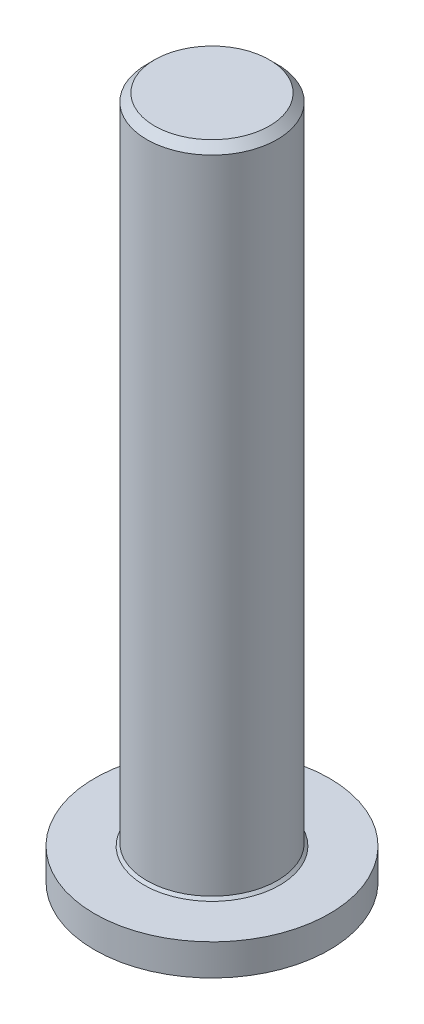
ISO-10303-21;
HEADER;
FILE_DESCRIPTION(('STEP AP214'),'2;1');
FILE_NAME('part.step','',(''),(''),'','','');
FILE_SCHEMA(('AUTOMOTIVE_DESIGN { 1 0 10303 214 1 1 1 1 }'));
ENDSEC;
DATA;
#1=APPLICATION_CONTEXT('core data for automotive mechanical design processes');
#2=APPLICATION_PROTOCOL_DEFINITION('international standard','automotive_design',2000,#1);
#3=PRODUCT_CONTEXT('',#1,'mechanical');
#4=PRODUCT('Part','Part','',(#3));
#5=PRODUCT_RELATED_PRODUCT_CATEGORY('part','',(#4));
#6=PRODUCT_DEFINITION_FORMATION('','',#4);
#7=PRODUCT_DEFINITION_CONTEXT('part definition',#1,'design');
#8=PRODUCT_DEFINITION('design','',#6,#7);
#9=PRODUCT_DEFINITION_SHAPE('','',#8);
#10=(LENGTH_UNIT() NAMED_UNIT(*) SI_UNIT(.MILLI.,.METRE.));
#11=(NAMED_UNIT(*) PLANE_ANGLE_UNIT() SI_UNIT($,.RADIAN.));
#12=(NAMED_UNIT(*) SI_UNIT($,.STERADIAN.) SOLID_ANGLE_UNIT());
#13=UNCERTAINTY_MEASURE_WITH_UNIT(LENGTH_MEASURE(1.E-05),#10,'distance_accuracy_value','');
#14=(GEOMETRIC_REPRESENTATION_CONTEXT(3) GLOBAL_UNCERTAINTY_ASSIGNED_CONTEXT((#13)) GLOBAL_UNIT_ASSIGNED_CONTEXT((#10,
#11,#12)) REPRESENTATION_CONTEXT('',''));
#15=CARTESIAN_POINT('',(0.,0.,0.));
#16=DIRECTION('',(0.,0.,1.));
#17=DIRECTION('',(1.,0.,0.));
#18=AXIS2_PLACEMENT_3D('',#15,#16,#17);
#19=CARTESIAN_POINT('',(0.,1.5,0.));
#20=DIRECTION('',(0.,1.,0.));
#21=DIRECTION('',(0.,0.,1.));
#22=AXIS2_PLACEMENT_3D('',#19,#20,#21);
#23=PLANE('',#22);
#24=CARTESIAN_POINT('',(0.,1.5,0.));
#25=DIRECTION('',(0.,1.,0.));
#26=DIRECTION('',(0.,0.,1.));
#27=AXIS2_PLACEMENT_3D('',#24,#25,#26);
#28=CIRCLE('',#27,2.6);
#29=CARTESIAN_POINT('',(0.,1.5,2.6));
#30=VERTEX_POINT('',#29);
#31=EDGE_CURVE('E145',#30,#30,#28,.F.);
#32=ORIENTED_EDGE('',*,*,#31,.T.);
#33=EDGE_LOOP('',(#32));
#34=FACE_BOUND('',#33,.T.);
#35=CARTESIAN_POINT('',(0.,1.5,0.));
#36=DIRECTION('',(0.,1.,0.));
#37=DIRECTION('',(0.,0.,1.));
#38=AXIS2_PLACEMENT_3D('',#35,#36,#37);
#39=CIRCLE('',#38,4.5);
#40=CARTESIAN_POINT('',(0.,1.5,4.5));
#41=VERTEX_POINT('',#40);
#42=EDGE_CURVE('E134',#41,#41,#39,.T.);
#43=ORIENTED_EDGE('',*,*,#42,.T.);
#44=EDGE_LOOP('',(#43));
#45=FACE_BOUND('',#44,.T.);
#46=ADVANCED_FACE('F32',(#34,#45),#23,.T.);
#47=CARTESIAN_POINT('',(0.,1.5,0.));
#48=DIRECTION('',(0.,-1.,0.));
#49=DIRECTION('',(0.,0.,-1.));
#50=AXIS2_PLACEMENT_3D('',#47,#48,#49);
#51=CYLINDRICAL_SURFACE('',#50,4.5);
#52=CARTESIAN_POINT('',(0.,0.300000000000003,0.));
#53=DIRECTION('',(0.,1.,0.));
#54=DIRECTION('',(0.,0.,1.));
#55=AXIS2_PLACEMENT_3D('',#52,#53,#54);
#56=CIRCLE('',#55,4.5);
#57=CARTESIAN_POINT('',(0.,0.300000000000003,4.5));
#58=VERTEX_POINT('',#57);
#59=EDGE_CURVE('E148',#58,#58,#56,.T.);
#60=ORIENTED_EDGE('',*,*,#59,.T.);
#61=EDGE_LOOP('',(#60));
#62=FACE_BOUND('',#61,.T.);
#63=ORIENTED_EDGE('',*,*,#42,.F.);
#64=EDGE_LOOP('',(#63));
#65=FACE_BOUND('',#64,.T.);
#66=ADVANCED_FACE('F167',(#62,#65),#51,.T.);
#67=CARTESIAN_POINT('',(0.,0.,0.));
#68=DIRECTION('',(0.,1.,0.));
#69=DIRECTION('',(0.,0.,1.));
#70=AXIS2_PLACEMENT_3D('',#67,#68,#69);
#71=PLANE('',#70);
#72=DIRECTION('',(-0.717801415460528,0.,-0.696247892609279));
#73=VECTOR('',#72,1.);
#74=CARTESIAN_POINT('',(-0.422737578252671,0.,1.6796704855218));
#75=LINE('',#74,#73);
#76=CARTESIAN_POINT('',(-0.422737578252671,0.,1.6796704855218));
#77=VERTEX_POINT('',#76);
#78=CARTESIAN_POINT('',(-1.66600609957516,0.,0.473733760859775));
#79=VERTEX_POINT('',#78);
#80=EDGE_CURVE('E121',#77,#79,#75,.T.);
#81=ORIENTED_EDGE('',*,*,#80,.F.);
#82=DIRECTION('',(-0.961869070061279,0.,0.273510314356606));
#83=VECTOR('',#82,1.);
#84=CARTESIAN_POINT('',(1.24326852132249,0.,1.20593672466203));
#85=LINE('',#84,#83);
#86=CARTESIAN_POINT('',(1.24326852132249,0.,1.20593672466203));
#87=VERTEX_POINT('',#86);
#88=EDGE_CURVE('E47',#87,#77,#85,.T.);
#89=ORIENTED_EDGE('',*,*,#88,.F.);
#90=DIRECTION('',(-0.244067654600751,0.,0.969758206965885));
#91=VECTOR('',#90,1.);
#92=CARTESIAN_POINT('',(1.66600609957516,0.,-0.473733760859776));
#93=LINE('',#92,#91);
#94=CARTESIAN_POINT('',(1.66600609957516,0.,-0.473733760859776));
#95=VERTEX_POINT('',#94);
#96=EDGE_CURVE('E130',#95,#87,#93,.T.);
#97=ORIENTED_EDGE('',*,*,#96,.F.);
#98=DIRECTION('',(0.717801415460528,0.,0.696247892609279));
#99=VECTOR('',#98,1.);
#100=CARTESIAN_POINT('',(0.422737578252671,0.,-1.6796704855218));
#101=LINE('',#100,#99);
#102=CARTESIAN_POINT('',(0.422737578252671,0.,-1.6796704855218));
#103=VERTEX_POINT('',#102);
#104=EDGE_CURVE('E128',#103,#95,#101,.T.);
#105=ORIENTED_EDGE('',*,*,#104,.F.);
#106=DIRECTION('',(0.961869070061279,0.,-0.273510314356606));
#107=VECTOR('',#106,1.);
#108=CARTESIAN_POINT('',(-1.24326852132249,0.,-1.20593672466203));
#109=LINE('',#108,#107);
#110=CARTESIAN_POINT('',(-1.24326852132249,0.,-1.20593672466203));
#111=VERTEX_POINT('',#110);
#112=EDGE_CURVE('E95',#111,#103,#109,.T.);
#113=ORIENTED_EDGE('',*,*,#112,.F.);
#114=DIRECTION('',(0.244067654600751,0.,-0.969758206965885));
#115=VECTOR('',#114,1.);
#116=CARTESIAN_POINT('',(-1.66600609957516,0.,0.473733760859775));
#117=LINE('',#116,#115);
#118=EDGE_CURVE('E124',#79,#111,#117,.T.);
#119=ORIENTED_EDGE('',*,*,#118,.F.);
#120=EDGE_LOOP('',(#81,#89,#97,#105,#113,#119));
#121=FACE_BOUND('',#120,.T.);
#122=CARTESIAN_POINT('',(0.,0.,0.));
#123=DIRECTION('',(0.,1.,0.));
#124=DIRECTION('',(0.,0.,1.));
#125=AXIS2_PLACEMENT_3D('',#122,#123,#124);
#126=CIRCLE('',#125,3.74999999999999);
#127=CARTESIAN_POINT('',(0.,0.,3.74999999999999));
#128=VERTEX_POINT('',#127);
#129=EDGE_CURVE('E151',#128,#128,#126,.F.);
#130=ORIENTED_EDGE('',*,*,#129,.T.);
#131=EDGE_LOOP('',(#130));
#132=FACE_BOUND('',#131,.T.);
#133=ADVANCED_FACE('F173',(#121,#132),#71,.F.);
#134=CARTESIAN_POINT('',(0.,26.5,0.));
#135=DIRECTION('',(0.,-1.,0.));
#136=DIRECTION('',(0.,0.,-1.));
#137=AXIS2_PLACEMENT_3D('',#134,#135,#136);
#138=CYLINDRICAL_SURFACE('',#137,2.5);
#139=CARTESIAN_POINT('',(0.,26.2,0.));
#140=DIRECTION('',(0.,1.,0.));
#141=DIRECTION('',(0.,0.,1.));
#142=AXIS2_PLACEMENT_3D('',#139,#140,#141);
#143=CIRCLE('',#142,2.5);
#144=CARTESIAN_POINT('',(0.,26.2,2.5));
#145=VERTEX_POINT('',#144);
#146=EDGE_CURVE('E11',#145,#145,#143,.F.);
#147=ORIENTED_EDGE('',*,*,#146,.T.);
#148=EDGE_LOOP('',(#147));
#149=FACE_BOUND('',#148,.T.);
#150=CARTESIAN_POINT('',(0.,1.6,0.));
#151=DIRECTION('',(0.,1.,0.));
#152=DIRECTION('',(0.,0.,1.));
#153=AXIS2_PLACEMENT_3D('',#150,#151,#152);
#154=CIRCLE('',#153,2.5);
#155=CARTESIAN_POINT('',(0.,1.6,2.5));
#156=VERTEX_POINT('',#155);
#157=EDGE_CURVE('E142',#156,#156,#154,.T.);
#158=ORIENTED_EDGE('',*,*,#157,.T.);
#159=EDGE_LOOP('',(#158));
#160=FACE_BOUND('',#159,.T.);
#161=ADVANCED_FACE('F179',(#149,#160),#138,.T.);
#162=CARTESIAN_POINT('',(0.,26.5,0.));
#163=DIRECTION('',(0.,1.,0.));
#164=DIRECTION('',(0.,0.,1.));
#165=AXIS2_PLACEMENT_3D('',#162,#163,#164);
#166=PLANE('',#165);
#167=CARTESIAN_POINT('',(0.,26.5,0.));
#168=DIRECTION('',(0.,1.,0.));
#169=DIRECTION('',(0.,0.,1.));
#170=AXIS2_PLACEMENT_3D('',#167,#168,#169);
#171=CIRCLE('',#170,2.2);
#172=CARTESIAN_POINT('',(0.,26.5,2.2));
#173=VERTEX_POINT('',#172);
#174=EDGE_CURVE('E40',#173,#173,#171,.T.);
#175=ORIENTED_EDGE('',*,*,#174,.T.);
#176=EDGE_LOOP('',(#175));
#177=FACE_BOUND('',#176,.T.);
#178=ADVANCED_FACE('F156',(#177),#166,.T.);
#179=CARTESIAN_POINT('',(0.,1.6,0.));
#180=DIRECTION('',(0.,-1.,0.));
#181=DIRECTION('',(0.,0.,-1.));
#182=AXIS2_PLACEMENT_3D('',#179,#180,#181);
#183=CONICAL_SURFACE('',#182,2.5,0.785398163397442);
#184=ORIENTED_EDGE('',*,*,#31,.F.);
#185=EDGE_LOOP('',(#184));
#186=FACE_BOUND('',#185,.T.);
#187=ORIENTED_EDGE('',*,*,#157,.F.);
#188=EDGE_LOOP('',(#187));
#189=FACE_BOUND('',#188,.T.);
#190=ADVANCED_FACE('F184',(#186,#189),#183,.T.);
#191=CARTESIAN_POINT('',(0.,0.300000000000003,0.));
#192=DIRECTION('',(0.,1.,0.));
#193=DIRECTION('',(0.,0.,1.));
#194=AXIS2_PLACEMENT_3D('',#191,#192,#193);
#195=CONICAL_SURFACE('',#194,4.5,1.19028994968253);
#196=ORIENTED_EDGE('',*,*,#129,.F.);
#197=EDGE_LOOP('',(#196));
#198=FACE_BOUND('',#197,.T.);
#199=ORIENTED_EDGE('',*,*,#59,.F.);
#200=EDGE_LOOP('',(#199));
#201=FACE_BOUND('',#200,.T.);
#202=ADVANCED_FACE('F186',(#198,#201),#195,.T.);
#203=CARTESIAN_POINT('',(1.24326852132249,3.,1.20593672466203));
#204=DIRECTION('',(0.273510314356606,0.,0.961869070061279));
#205=DIRECTION('',(0.961869070061279,0.,-0.273510314356606));
#206=AXIS2_PLACEMENT_3D('',#203,#204,#205);
#207=PLANE('',#206);
#208=ORIENTED_EDGE('',*,*,#88,.T.);
#209=DIRECTION('',(0.,-1.,0.));
#210=VECTOR('',#209,1.);
#211=CARTESIAN_POINT('',(-0.422737578252671,3.,1.6796704855218));
#212=LINE('',#211,#210);
#213=CARTESIAN_POINT('',(-0.422737578252671,3.,1.6796704855218));
#214=VERTEX_POINT('',#213);
#215=EDGE_CURVE('E77',#214,#77,#212,.T.);
#216=ORIENTED_EDGE('',*,*,#215,.F.);
#217=DIRECTION('',(-0.961869070061279,0.,0.273510314356606));
#218=VECTOR('',#217,1.);
#219=CARTESIAN_POINT('',(1.24326852132249,3.,1.20593672466203));
#220=LINE('',#219,#218);
#221=CARTESIAN_POINT('',(1.24326852132249,3.,1.20593672466203));
#222=VERTEX_POINT('',#221);
#223=EDGE_CURVE('E132',#222,#214,#220,.T.);
#224=ORIENTED_EDGE('',*,*,#223,.F.);
#225=DIRECTION('',(0.,-1.,0.));
#226=VECTOR('',#225,1.);
#227=CARTESIAN_POINT('',(1.24326852132249,3.,1.20593672466203));
#228=LINE('',#227,#226);
#229=EDGE_CURVE('E55',#222,#87,#228,.T.);
#230=ORIENTED_EDGE('',*,*,#229,.T.);
#231=EDGE_LOOP('',(#208,#216,#224,#230));
#232=FACE_BOUND('',#231,.T.);
#233=ADVANCED_FACE('F189',(#232),#207,.F.);
#234=CARTESIAN_POINT('',(1.66600609957516,3.,-0.473733760859776));
#235=DIRECTION('',(0.969758206965885,0.,0.244067654600751));
#236=DIRECTION('',(0.244067654600751,0.,-0.969758206965885));
#237=AXIS2_PLACEMENT_3D('',#234,#235,#236);
#238=PLANE('',#237);
#239=ORIENTED_EDGE('',*,*,#96,.T.);
#240=ORIENTED_EDGE('',*,*,#229,.F.);
#241=DIRECTION('',(-0.244067654600751,0.,0.969758206965885));
#242=VECTOR('',#241,1.);
#243=CARTESIAN_POINT('',(1.66600609957516,3.,-0.473733760859776));
#244=LINE('',#243,#242);
#245=CARTESIAN_POINT('',(1.66600609957516,3.,-0.473733760859776));
#246=VERTEX_POINT('',#245);
#247=EDGE_CURVE('E107',#246,#222,#244,.T.);
#248=ORIENTED_EDGE('',*,*,#247,.F.);
#249=DIRECTION('',(0.,-1.,0.));
#250=VECTOR('',#249,1.);
#251=CARTESIAN_POINT('',(1.66600609957516,3.,-0.473733760859776));
#252=LINE('',#251,#250);
#253=EDGE_CURVE('E99',#246,#95,#252,.T.);
#254=ORIENTED_EDGE('',*,*,#253,.T.);
#255=EDGE_LOOP('',(#239,#240,#248,#254));
#256=FACE_BOUND('',#255,.T.);
#257=ADVANCED_FACE('F194',(#256),#238,.F.);
#258=CARTESIAN_POINT('',(0.422737578252671,3.,-1.6796704855218));
#259=DIRECTION('',(0.696247892609279,0.,-0.717801415460528));
#260=DIRECTION('',(-0.717801415460528,0.,-0.696247892609279));
#261=AXIS2_PLACEMENT_3D('',#258,#259,#260);
#262=PLANE('',#261);
#263=ORIENTED_EDGE('',*,*,#104,.T.);
#264=ORIENTED_EDGE('',*,*,#253,.F.);
#265=DIRECTION('',(0.717801415460528,0.,0.696247892609279));
#266=VECTOR('',#265,1.);
#267=CARTESIAN_POINT('',(0.422737578252671,3.,-1.6796704855218));
#268=LINE('',#267,#266);
#269=CARTESIAN_POINT('',(0.422737578252671,3.,-1.6796704855218));
#270=VERTEX_POINT('',#269);
#271=EDGE_CURVE('E103',#270,#246,#268,.T.);
#272=ORIENTED_EDGE('',*,*,#271,.F.);
#273=DIRECTION('',(0.,-1.,0.));
#274=VECTOR('',#273,1.);
#275=CARTESIAN_POINT('',(0.422737578252671,3.,-1.6796704855218));
#276=LINE('',#275,#274);
#277=EDGE_CURVE('E88',#270,#103,#276,.T.);
#278=ORIENTED_EDGE('',*,*,#277,.T.);
#279=EDGE_LOOP('',(#263,#264,#272,#278));
#280=FACE_BOUND('',#279,.T.);
#281=ADVANCED_FACE('F104',(#280),#262,.F.);
#282=CARTESIAN_POINT('',(-1.24326852132249,3.,-1.20593672466203));
#283=DIRECTION('',(-0.273510314356606,0.,-0.961869070061279));
#284=DIRECTION('',(-0.961869070061279,0.,0.273510314356606));
#285=AXIS2_PLACEMENT_3D('',#282,#283,#284);
#286=PLANE('',#285);
#287=ORIENTED_EDGE('',*,*,#112,.T.);
#288=ORIENTED_EDGE('',*,*,#277,.F.);
#289=DIRECTION('',(0.961869070061279,0.,-0.273510314356606));
#290=VECTOR('',#289,1.);
#291=CARTESIAN_POINT('',(-1.24326852132249,3.,-1.20593672466203));
#292=LINE('',#291,#290);
#293=CARTESIAN_POINT('',(-1.24326852132249,3.,-1.20593672466203));
#294=VERTEX_POINT('',#293);
#295=EDGE_CURVE('E92',#294,#270,#292,.T.);
#296=ORIENTED_EDGE('',*,*,#295,.F.);
#297=DIRECTION('',(0.,-1.,0.));
#298=VECTOR('',#297,1.);
#299=CARTESIAN_POINT('',(-1.24326852132249,3.,-1.20593672466203));
#300=LINE('',#299,#298);
#301=EDGE_CURVE('E100',#294,#111,#300,.T.);
#302=ORIENTED_EDGE('',*,*,#301,.T.);
#303=EDGE_LOOP('',(#287,#288,#296,#302));
#304=FACE_BOUND('',#303,.T.);
#305=ADVANCED_FACE('F90',(#304),#286,.F.);
#306=CARTESIAN_POINT('',(-1.66600609957516,3.,0.473733760859775));
#307=DIRECTION('',(-0.969758206965885,0.,-0.244067654600751));
#308=DIRECTION('',(-0.244067654600751,0.,0.969758206965885));
#309=AXIS2_PLACEMENT_3D('',#306,#307,#308);
#310=PLANE('',#309);
#311=ORIENTED_EDGE('',*,*,#118,.T.);
#312=ORIENTED_EDGE('',*,*,#301,.F.);
#313=DIRECTION('',(0.244067654600751,0.,-0.969758206965885));
#314=VECTOR('',#313,1.);
#315=CARTESIAN_POINT('',(-1.66600609957516,3.,0.473733760859775));
#316=LINE('',#315,#314);
#317=CARTESIAN_POINT('',(-1.66600609957516,3.,0.473733760859775));
#318=VERTEX_POINT('',#317);
#319=EDGE_CURVE('E113',#318,#294,#316,.T.);
#320=ORIENTED_EDGE('',*,*,#319,.F.);
#321=DIRECTION('',(0.,-1.,0.));
#322=VECTOR('',#321,1.);
#323=CARTESIAN_POINT('',(-1.66600609957516,3.,0.473733760859775));
#324=LINE('',#323,#322);
#325=EDGE_CURVE('E137',#318,#79,#324,.T.);
#326=ORIENTED_EDGE('',*,*,#325,.T.);
#327=EDGE_LOOP('',(#311,#312,#320,#326));
#328=FACE_BOUND('',#327,.T.);
#329=ADVANCED_FACE('F263',(#328),#310,.F.);
#330=CARTESIAN_POINT('',(-0.422737578252671,3.,1.6796704855218));
#331=DIRECTION('',(-0.696247892609279,0.,0.717801415460528));
#332=DIRECTION('',(0.717801415460528,0.,0.696247892609279));
#333=AXIS2_PLACEMENT_3D('',#330,#331,#332);
#334=PLANE('',#333);
#335=ORIENTED_EDGE('',*,*,#80,.T.);
#336=ORIENTED_EDGE('',*,*,#325,.F.);
#337=DIRECTION('',(-0.717801415460528,0.,-0.696247892609279));
#338=VECTOR('',#337,1.);
#339=CARTESIAN_POINT('',(-0.422737578252671,3.,1.6796704855218));
#340=LINE('',#339,#338);
#341=EDGE_CURVE('E115',#214,#318,#340,.T.);
#342=ORIENTED_EDGE('',*,*,#341,.F.);
#343=ORIENTED_EDGE('',*,*,#215,.T.);
#344=EDGE_LOOP('',(#335,#336,#342,#343));
#345=FACE_BOUND('',#344,.T.);
#346=ADVANCED_FACE('F163',(#345),#334,.F.);
#347=CARTESIAN_POINT('',(0.,3.,0.));
#348=DIRECTION('',(0.,-1.,0.));
#349=DIRECTION('',(0.,0.,-1.));
#350=AXIS2_PLACEMENT_3D('',#347,#348,#349);
#351=PLANE('',#350);
#352=ORIENTED_EDGE('',*,*,#223,.T.);
#353=ORIENTED_EDGE('',*,*,#341,.T.);
#354=ORIENTED_EDGE('',*,*,#319,.T.);
#355=ORIENTED_EDGE('',*,*,#295,.T.);
#356=ORIENTED_EDGE('',*,*,#271,.T.);
#357=ORIENTED_EDGE('',*,*,#247,.T.);
#358=EDGE_LOOP('',(#352,#353,#354,#355,#356,#357));
#359=FACE_BOUND('',#358,.T.);
#360=ADVANCED_FACE('F110',(#359),#351,.T.);
#361=CARTESIAN_POINT('',(0.,26.5,0.));
#362=DIRECTION('',(0.,-1.,0.));
#363=DIRECTION('',(0.,0.,-1.));
#364=AXIS2_PLACEMENT_3D('',#361,#362,#363);
#365=CONICAL_SURFACE('',#364,2.2,0.78539816339745);
#366=ORIENTED_EDGE('',*,*,#146,.F.);
#367=EDGE_LOOP('',(#366));
#368=FACE_BOUND('',#367,.T.);
#369=ORIENTED_EDGE('',*,*,#174,.F.);
#370=EDGE_LOOP('',(#369));
#371=FACE_BOUND('',#370,.T.);
#372=ADVANCED_FACE('F34',(#368,#371),#365,.T.);
#373=CLOSED_SHELL('',(#46,#66,#133,#161,#178,#190,#202,#233,#257,#281,#305,#329,#346,#360,#372));
#374=MANIFOLD_SOLID_BREP('B2',#373);
#375=ADVANCED_BREP_SHAPE_REPRESENTATION('',(#18,#374),#14);
#376=SHAPE_DEFINITION_REPRESENTATION(#9,#375);
ENDSEC;
END-ISO-10303-21;
